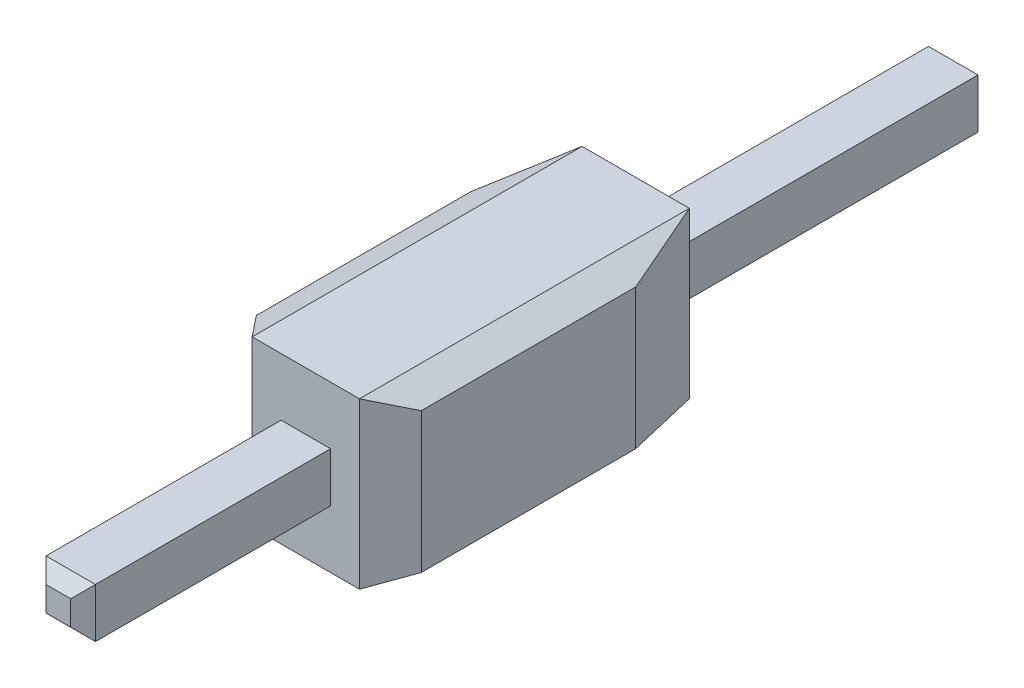
ISO-10303-21;
HEADER;
FILE_DESCRIPTION(('STEP AP214'),'2;1');
FILE_NAME('part.step','',(''),(''),'','','');
FILE_SCHEMA(('AUTOMOTIVE_DESIGN { 1 0 10303 214 1 1 1 1 }'));
ENDSEC;
DATA;
#1=APPLICATION_CONTEXT('core data for automotive mechanical design processes');
#2=APPLICATION_PROTOCOL_DEFINITION('international standard','automotive_design',2000,#1);
#3=PRODUCT_CONTEXT('',#1,'mechanical');
#4=PRODUCT('Part','Part','',(#3));
#5=PRODUCT_RELATED_PRODUCT_CATEGORY('part','',(#4));
#6=PRODUCT_DEFINITION_FORMATION('','',#4);
#7=PRODUCT_DEFINITION_CONTEXT('part definition',#1,'design');
#8=PRODUCT_DEFINITION('design','',#6,#7);
#9=PRODUCT_DEFINITION_SHAPE('','',#8);
#10=(LENGTH_UNIT() NAMED_UNIT(*) SI_UNIT(.MILLI.,.METRE.));
#11=(NAMED_UNIT(*) PLANE_ANGLE_UNIT() SI_UNIT($,.RADIAN.));
#12=(NAMED_UNIT(*) SI_UNIT($,.STERADIAN.) SOLID_ANGLE_UNIT());
#13=UNCERTAINTY_MEASURE_WITH_UNIT(LENGTH_MEASURE(1.E-05),#10,'distance_accuracy_value','');
#14=(GEOMETRIC_REPRESENTATION_CONTEXT(3) GLOBAL_UNCERTAINTY_ASSIGNED_CONTEXT((#13)) GLOBAL_UNIT_ASSIGNED_CONTEXT((#10,
#11,#12)) REPRESENTATION_CONTEXT('',''));
#15=CARTESIAN_POINT('',(0.,0.,0.));
#16=DIRECTION('',(0.,0.,1.));
#17=DIRECTION('',(1.,0.,0.));
#18=AXIS2_PLACEMENT_3D('',#15,#16,#17);
#19=CARTESIAN_POINT('',(-1.27,1.079,1.27));
#20=DIRECTION('',(-1.,0.,0.));
#21=DIRECTION('',(0.,0.,1.));
#22=AXIS2_PLACEMENT_3D('',#19,#20,#21);
#23=PLANE('',#22);
#24=CARTESIAN_POINT('',(-1.27,1.079,1.27));
#25=DIRECTION('',(0.,-1.,0.));
#26=VECTOR('',#25,1.);
#27=LINE('',#24,#26);
#28=CARTESIAN_POINT('',(-1.27,1.079,1.27));
#29=VERTEX_POINT('',#28);
#30=CARTESIAN_POINT('',(-1.27,-1.079,1.27));
#31=VERTEX_POINT('',#30);
#32=EDGE_CURVE('P0_E11',#29,#31,#27,.T.);
#33=ORIENTED_EDGE('',*,*,#32,.T.);
#34=DIRECTION('',(0.,0.,1.));
#35=VECTOR('',#34,1.);
#36=CARTESIAN_POINT('',(-1.27,-1.079,1.27));
#37=LINE('',#36,#35);
#38=CARTESIAN_POINT('',(-1.27,-1.079,4.572));
#39=VERTEX_POINT('',#38);
#40=EDGE_CURVE('P0_E118',#31,#39,#37,.T.);
#41=ORIENTED_EDGE('',*,*,#40,.T.);
#42=DIRECTION('',(0.,1.,0.));
#43=VECTOR('',#42,1.);
#44=CARTESIAN_POINT('',(-1.27,-1.079,4.572));
#45=LINE('',#44,#43);
#46=CARTESIAN_POINT('',(-1.27,1.079,4.572));
#47=VERTEX_POINT('',#46);
#48=EDGE_CURVE('P0_E359',#39,#47,#45,.T.);
#49=ORIENTED_EDGE('',*,*,#48,.T.);
#50=CARTESIAN_POINT('',(-1.27,1.079,4.572));
#51=DIRECTION('',(0.,0.,-1.));
#52=VECTOR('',#51,1.);
#53=LINE('',#50,#52);
#54=EDGE_CURVE('P0_E137',#47,#29,#53,.T.);
#55=ORIENTED_EDGE('',*,*,#54,.T.);
#56=EDGE_LOOP('',(#33,#41,#49,#55));
#57=FACE_BOUND('',#56,.T.);
#58=ADVANCED_FACE('P0_F17',(#57),#23,.T.);
#59=CARTESIAN_POINT('',(-0.826,1.27,0.));
#60=DIRECTION('',(-0.94398300845877,0.,-0.329994060160375));
#61=DIRECTION('',(-0.329994060160375,0.,0.94398300845877));
#62=AXIS2_PLACEMENT_3D('',#59,#60,#61);
#63=PLANE('',#62);
#64=DIRECTION('',(0.,-1.,0.));
#65=VECTOR('',#64,1.);
#66=CARTESIAN_POINT('',(-0.826,1.27,0.));
#67=LINE('',#66,#65);
#68=CARTESIAN_POINT('',(-0.826,1.27,0.));
#69=VERTEX_POINT('',#68);
#70=CARTESIAN_POINT('',(-0.826,-1.27,0.));
#71=VERTEX_POINT('',#70);
#72=EDGE_CURVE('P0_E30',#69,#71,#67,.T.);
#73=ORIENTED_EDGE('',*,*,#72,.T.);
#74=CARTESIAN_POINT('',(-0.826,-1.27,0.));
#75=DIRECTION('',(-0.326746575551969,0.139947251159873,0.934693234306238));
#76=VECTOR('',#75,1.);
#77=LINE('',#74,#76);
#78=EDGE_CURVE('P0_E103',#71,#31,#77,.T.);
#79=ORIENTED_EDGE('',*,*,#78,.T.);
#80=ORIENTED_EDGE('',*,*,#32,.F.);
#81=CARTESIAN_POINT('',(-1.26996601722338,1.079,1.27001187957233));
#82=DIRECTION('',(0.326746575551969,0.139947251159874,-0.934693234306238));
#83=VECTOR('',#82,1.);
#84=LINE('',#81,#83);
#85=EDGE_CURVE('P0_E106',#29,#69,#84,.T.);
#86=ORIENTED_EDGE('',*,*,#85,.T.);
#87=EDGE_LOOP('',(#73,#79,#80,#86));
#88=FACE_BOUND('',#87,.T.);
#89=ADVANCED_FACE('P0_F101',(#88),#63,.T.);
#90=CARTESIAN_POINT('',(-0.826,1.27,0.));
#91=DIRECTION('',(0.,0.,-1.));
#92=DIRECTION('',(0.,-1.,0.));
#93=AXIS2_PLACEMENT_3D('',#90,#91,#92);
#94=PLANE('',#93);
#95=DIRECTION('',(1.,0.,0.));
#96=VECTOR('',#95,1.);
#97=CARTESIAN_POINT('',(-0.826,1.27,0.));
#98=LINE('',#97,#96);
#99=CARTESIAN_POINT('',(0.826,1.27,0.));
#100=VERTEX_POINT('',#99);
#101=EDGE_CURVE('P0_E440',#69,#100,#98,.T.);
#102=ORIENTED_EDGE('',*,*,#101,.T.);
#103=DIRECTION('',(0.,-1.,0.));
#104=VECTOR('',#103,1.);
#105=CARTESIAN_POINT('',(0.826,1.27,0.));
#106=LINE('',#105,#104);
#107=CARTESIAN_POINT('',(0.826,-1.27,0.));
#108=VERTEX_POINT('',#107);
#109=EDGE_CURVE('P0_E43',#100,#108,#106,.T.);
#110=ORIENTED_EDGE('',*,*,#109,.T.);
#111=DIRECTION('',(-1.,0.,0.));
#112=VECTOR('',#111,1.);
#113=CARTESIAN_POINT('',(0.826,-1.27,0.));
#114=LINE('',#113,#112);
#115=EDGE_CURVE('P0_E112',#108,#71,#114,.T.);
#116=ORIENTED_EDGE('',*,*,#115,.T.);
#117=ORIENTED_EDGE('',*,*,#72,.F.);
#118=EDGE_LOOP('',(#102,#110,#116,#117));
#119=FACE_BOUND('',#118,.T.);
#120=ADVANCED_FACE('P0_F114',(#119),#94,.T.);
#121=CARTESIAN_POINT('',(0.826,-1.27,0.));
#122=DIRECTION('',(0.94398300845877,0.,-0.329994060160375));
#123=DIRECTION('',(0.,-1.,0.));
#124=AXIS2_PLACEMENT_3D('',#121,#122,#123);
#125=PLANE('',#124);
#126=ORIENTED_EDGE('',*,*,#109,.F.);
#127=CARTESIAN_POINT('',(0.826,1.27,0.));
#128=DIRECTION('',(0.326746575551969,-0.139947251159873,0.934693234306238));
#129=VECTOR('',#128,1.);
#130=LINE('',#127,#129);
#131=CARTESIAN_POINT('',(1.27,1.079,1.27));
#132=VERTEX_POINT('',#131);
#133=EDGE_CURVE('P0_E419',#100,#132,#130,.T.);
#134=ORIENTED_EDGE('',*,*,#133,.T.);
#135=CARTESIAN_POINT('',(1.26996601722338,1.079,1.27001187957233));
#136=DIRECTION('',(0.,-1.,0.));
#137=VECTOR('',#136,1.);
#138=LINE('',#135,#137);
#139=CARTESIAN_POINT('',(1.27,-1.079,1.27));
#140=VERTEX_POINT('',#139);
#141=EDGE_CURVE('P0_E365',#132,#140,#138,.T.);
#142=ORIENTED_EDGE('',*,*,#141,.T.);
#143=CARTESIAN_POINT('',(1.26996601722338,-1.079,1.27001187957233));
#144=DIRECTION('',(-0.326746575551969,-0.139947251159874,-0.934693234306238));
#145=VECTOR('',#144,1.);
#146=LINE('',#143,#145);
#147=EDGE_CURVE('P0_E443',#140,#108,#146,.T.);
#148=ORIENTED_EDGE('',*,*,#147,.T.);
#149=EDGE_LOOP('',(#126,#134,#142,#148));
#150=FACE_BOUND('',#149,.T.);
#151=ADVANCED_FACE('P0_F225',(#150),#125,.T.);
#152=CARTESIAN_POINT('',(0.826,-1.27,0.));
#153=DIRECTION('',(0.39403999708966,-0.919093292704054,0.));
#154=DIRECTION('',(0.,0.,-1.));
#155=AXIS2_PLACEMENT_3D('',#152,#153,#154);
#156=PLANE('',#155);
#157=ORIENTED_EDGE('',*,*,#147,.F.);
#158=CARTESIAN_POINT('',(1.27023368943896,-1.07954507765076,1.27));
#159=DIRECTION('',(0.,0.,1.));
#160=VECTOR('',#159,1.);
#161=LINE('',#158,#160);
#162=CARTESIAN_POINT('',(1.27,-1.079,4.572));
#163=VERTEX_POINT('',#162);
#164=EDGE_CURVE('P0_E310',#140,#163,#161,.T.);
#165=ORIENTED_EDGE('',*,*,#164,.T.);
#166=CARTESIAN_POINT('',(1.27023368943896,-1.07954507765076,4.572));
#167=DIRECTION('',(-0.634031018406954,-0.27182613846827,0.723958022362672));
#168=VECTOR('',#167,1.);
#169=LINE('',#166,#168);
#170=CARTESIAN_POINT('',(0.826,-1.27,5.08));
#171=VERTEX_POINT('',#170);
#172=EDGE_CURVE('P0_E270',#163,#171,#169,.T.);
#173=ORIENTED_EDGE('',*,*,#172,.T.);
#174=DIRECTION('',(0.,0.,-1.));
#175=VECTOR('',#174,1.);
#176=CARTESIAN_POINT('',(0.826,-1.27,5.08));
#177=LINE('',#176,#175);
#178=EDGE_CURVE('P0_E117',#171,#108,#177,.T.);
#179=ORIENTED_EDGE('',*,*,#178,.T.);
#180=EDGE_LOOP('',(#157,#165,#173,#179));
#181=FACE_BOUND('',#180,.T.);
#182=ADVANCED_FACE('P0_F275',(#181),#156,.T.);
#183=CARTESIAN_POINT('',(-0.826,-1.27,0.));
#184=DIRECTION('',(0.,-1.,0.));
#185=DIRECTION('',(0.,0.,-1.));
#186=AXIS2_PLACEMENT_3D('',#183,#184,#185);
#187=PLANE('',#186);
#188=ORIENTED_EDGE('',*,*,#115,.F.);
#189=ORIENTED_EDGE('',*,*,#178,.F.);
#190=DIRECTION('',(-1.,0.,0.));
#191=VECTOR('',#190,1.);
#192=CARTESIAN_POINT('',(0.826,-1.27,5.08));
#193=LINE('',#192,#191);
#194=CARTESIAN_POINT('',(-0.826,-1.27,5.08));
#195=VERTEX_POINT('',#194);
#196=EDGE_CURVE('P0_E125',#171,#195,#193,.T.);
#197=ORIENTED_EDGE('',*,*,#196,.T.);
#198=CARTESIAN_POINT('',(-0.826,-1.27,5.08));
#199=DIRECTION('',(0.,0.,-1.));
#200=VECTOR('',#199,1.);
#201=LINE('',#198,#200);
#202=EDGE_CURVE('P0_E121',#195,#71,#201,.T.);
#203=ORIENTED_EDGE('',*,*,#202,.T.);
#204=EDGE_LOOP('',(#188,#189,#197,#203));
#205=FACE_BOUND('',#204,.T.);
#206=ADVANCED_FACE('P0_F123',(#205),#187,.T.);
#207=CARTESIAN_POINT('',(-1.27,-1.079,1.27));
#208=DIRECTION('',(-0.39403999708966,-0.919093292704054,0.));
#209=DIRECTION('',(-0.919093292704054,0.39403999708966,0.));
#210=AXIS2_PLACEMENT_3D('',#207,#208,#209);
#211=PLANE('',#210);
#212=ORIENTED_EDGE('',*,*,#78,.F.);
#213=ORIENTED_EDGE('',*,*,#202,.F.);
#214=CARTESIAN_POINT('',(-0.825766310561044,-1.26945492234924,5.08));
#215=DIRECTION('',(-0.634031018406954,0.27182613846827,-0.723958022362671));
#216=VECTOR('',#215,1.);
#217=LINE('',#214,#216);
#218=EDGE_CURVE('P0_E183',#195,#39,#217,.T.);
#219=ORIENTED_EDGE('',*,*,#218,.T.);
#220=ORIENTED_EDGE('',*,*,#40,.F.);
#221=EDGE_LOOP('',(#212,#213,#219,#220));
#222=FACE_BOUND('',#221,.T.);
#223=ADVANCED_FACE('P0_F135',(#222),#211,.T.);
#224=CARTESIAN_POINT('',(-0.826,1.27,0.));
#225=DIRECTION('',(-0.39403999708966,0.919093292704054,0.));
#226=DIRECTION('',(0.,0.,1.));
#227=AXIS2_PLACEMENT_3D('',#224,#225,#226);
#228=PLANE('',#227);
#229=ORIENTED_EDGE('',*,*,#85,.F.);
#230=ORIENTED_EDGE('',*,*,#54,.F.);
#231=CARTESIAN_POINT('',(-1.27023368943896,1.07954507765076,4.572));
#232=DIRECTION('',(0.634031018406954,0.27182613846827,0.723958022362672));
#233=VECTOR('',#232,1.);
#234=LINE('',#231,#233);
#235=CARTESIAN_POINT('',(-0.826,1.27,5.08));
#236=VERTEX_POINT('',#235);
#237=EDGE_CURVE('P0_E342',#47,#236,#234,.T.);
#238=ORIENTED_EDGE('',*,*,#237,.T.);
#239=DIRECTION('',(0.,0.,-1.));
#240=VECTOR('',#239,1.);
#241=CARTESIAN_POINT('',(-0.826,1.27,5.08));
#242=LINE('',#241,#240);
#243=EDGE_CURVE('P0_E484',#236,#69,#242,.T.);
#244=ORIENTED_EDGE('',*,*,#243,.T.);
#245=EDGE_LOOP('',(#229,#230,#238,#244));
#246=FACE_BOUND('',#245,.T.);
#247=ADVANCED_FACE('P0_F157',(#246),#228,.T.);
#248=CARTESIAN_POINT('',(0.826,1.27,0.));
#249=DIRECTION('',(0.,1.,0.));
#250=DIRECTION('',(1.,0.,0.));
#251=AXIS2_PLACEMENT_3D('',#248,#249,#250);
#252=PLANE('',#251);
#253=ORIENTED_EDGE('',*,*,#101,.F.);
#254=ORIENTED_EDGE('',*,*,#243,.F.);
#255=DIRECTION('',(1.,0.,0.));
#256=VECTOR('',#255,1.);
#257=CARTESIAN_POINT('',(-0.826,1.27,5.08));
#258=LINE('',#257,#256);
#259=CARTESIAN_POINT('',(0.826,1.27,5.08));
#260=VERTEX_POINT('',#259);
#261=EDGE_CURVE('P0_E372',#236,#260,#258,.T.);
#262=ORIENTED_EDGE('',*,*,#261,.T.);
#263=CARTESIAN_POINT('',(0.826,1.27,5.08));
#264=DIRECTION('',(0.,0.,-1.));
#265=VECTOR('',#264,1.);
#266=LINE('',#263,#265);
#267=EDGE_CURVE('P0_E391',#260,#100,#266,.T.);
#268=ORIENTED_EDGE('',*,*,#267,.T.);
#269=EDGE_LOOP('',(#253,#254,#262,#268));
#270=FACE_BOUND('',#269,.T.);
#271=ADVANCED_FACE('P0_F325',(#270),#252,.T.);
#272=CARTESIAN_POINT('',(1.27,1.079,1.27));
#273=DIRECTION('',(0.39403999708966,0.919093292704054,0.));
#274=DIRECTION('',(0.,0.,-1.));
#275=AXIS2_PLACEMENT_3D('',#272,#273,#274);
#276=PLANE('',#275);
#277=ORIENTED_EDGE('',*,*,#133,.F.);
#278=ORIENTED_EDGE('',*,*,#267,.F.);
#279=CARTESIAN_POINT('',(0.825766310561044,1.26945492234924,5.08));
#280=DIRECTION('',(0.634031018406954,-0.27182613846827,-0.723958022362671));
#281=VECTOR('',#280,1.);
#282=LINE('',#279,#281);
#283=CARTESIAN_POINT('',(1.27,1.079,4.572));
#284=VERTEX_POINT('',#283);
#285=EDGE_CURVE('P0_E449',#260,#284,#282,.T.);
#286=ORIENTED_EDGE('',*,*,#285,.T.);
#287=DIRECTION('',(0.,0.,-1.));
#288=VECTOR('',#287,1.);
#289=CARTESIAN_POINT('',(1.27,1.079,4.572));
#290=LINE('',#289,#288);
#291=EDGE_CURVE('P0_E406',#284,#132,#290,.T.);
#292=ORIENTED_EDGE('',*,*,#291,.T.);
#293=EDGE_LOOP('',(#277,#278,#286,#292));
#294=FACE_BOUND('',#293,.T.);
#295=ADVANCED_FACE('P0_F223',(#294),#276,.T.);
#296=CARTESIAN_POINT('',(1.27,-1.079,1.27));
#297=DIRECTION('',(1.,0.,0.));
#298=DIRECTION('',(0.,1.,0.));
#299=AXIS2_PLACEMENT_3D('',#296,#297,#298);
#300=PLANE('',#299);
#301=ORIENTED_EDGE('',*,*,#141,.F.);
#302=ORIENTED_EDGE('',*,*,#291,.F.);
#303=DIRECTION('',(0.,-1.,0.));
#304=VECTOR('',#303,1.);
#305=CARTESIAN_POINT('',(1.27,1.079,4.572));
#306=LINE('',#305,#304);
#307=EDGE_CURVE('P0_E315',#284,#163,#306,.T.);
#308=ORIENTED_EDGE('',*,*,#307,.T.);
#309=ORIENTED_EDGE('',*,*,#164,.F.);
#310=EDGE_LOOP('',(#301,#302,#308,#309));
#311=FACE_BOUND('',#310,.T.);
#312=ADVANCED_FACE('P0_F317',(#311),#300,.T.);
#313=CARTESIAN_POINT('',(-1.27,-1.079,4.572));
#314=DIRECTION('',(-0.752514784395664,0.,0.658575355799127));
#315=DIRECTION('',(0.,1.,0.));
#316=AXIS2_PLACEMENT_3D('',#313,#314,#315);
#317=PLANE('',#316);
#318=ORIENTED_EDGE('',*,*,#218,.F.);
#319=CARTESIAN_POINT('',(-0.825669106852161,-1.27,5.0797104135665));
#320=DIRECTION('',(0.,1.,0.));
#321=VECTOR('',#320,1.);
#322=LINE('',#319,#321);
#323=EDGE_CURVE('P0_E195',#195,#236,#322,.T.);
#324=ORIENTED_EDGE('',*,*,#323,.T.);
#325=ORIENTED_EDGE('',*,*,#237,.F.);
#326=ORIENTED_EDGE('',*,*,#48,.F.);
#327=EDGE_LOOP('',(#318,#324,#325,#326));
#328=FACE_BOUND('',#327,.T.);
#329=ADVANCED_FACE('P0_F160',(#328),#317,.T.);
#330=CARTESIAN_POINT('',(-0.826,-1.27,5.08));
#331=DIRECTION('',(0.,0.,1.));
#332=DIRECTION('',(1.,0.,0.));
#333=AXIS2_PLACEMENT_3D('',#330,#331,#332);
#334=PLANE('',#333);
#335=ORIENTED_EDGE('',*,*,#196,.F.);
#336=CARTESIAN_POINT('',(0.826,-1.27,5.08));
#337=DIRECTION('',(0.,1.,0.));
#338=VECTOR('',#337,1.);
#339=LINE('',#336,#338);
#340=EDGE_CURVE('P0_E245',#171,#260,#339,.T.);
#341=ORIENTED_EDGE('',*,*,#340,.T.);
#342=ORIENTED_EDGE('',*,*,#261,.F.);
#343=ORIENTED_EDGE('',*,*,#323,.F.);
#344=EDGE_LOOP('',(#335,#341,#342,#343));
#345=FACE_BOUND('',#344,.T.);
#346=ADVANCED_FACE('P0_F213',(#345),#334,.T.);
#347=CARTESIAN_POINT('',(1.27,-1.079,4.572));
#348=DIRECTION('',(0.752514784395664,0.,0.658575355799127));
#349=DIRECTION('',(0.,-1.,0.));
#350=AXIS2_PLACEMENT_3D('',#347,#348,#349);
#351=PLANE('',#350);
#352=ORIENTED_EDGE('',*,*,#307,.F.);
#353=ORIENTED_EDGE('',*,*,#285,.F.);
#354=ORIENTED_EDGE('',*,*,#340,.F.);
#355=ORIENTED_EDGE('',*,*,#172,.F.);
#356=EDGE_LOOP('',(#352,#353,#354,#355));
#357=FACE_BOUND('',#356,.T.);
#358=ADVANCED_FACE('P0_F222',(#357),#351,.T.);
#359=CLOSED_SHELL('',(#58,#89,#120,#151,#182,#206,#223,#247,#271,#295,#312,#329,#346,#358));
#360=MANIFOLD_SOLID_BREP('P0_B1',#359);
#361=CARTESIAN_POINT('',(-0.381,0.381,5.08));
#362=DIRECTION('',(0.,0.,-1.));
#363=DIRECTION('',(0.,-1.,0.));
#364=AXIS2_PLACEMENT_3D('',#361,#362,#363);
#365=PLANE('',#364);
#366=DIRECTION('',(1.,0.,0.));
#367=VECTOR('',#366,1.);
#368=CARTESIAN_POINT('',(-0.381,0.381,5.08));
#369=LINE('',#368,#367);
#370=CARTESIAN_POINT('',(-0.381,0.381,5.08));
#371=VERTEX_POINT('',#370);
#372=CARTESIAN_POINT('',(0.381,0.381,5.08));
#373=VERTEX_POINT('',#372);
#374=EDGE_CURVE('P1_E302',#371,#373,#369,.T.);
#375=ORIENTED_EDGE('',*,*,#374,.T.);
#376=DIRECTION('',(0.,-1.,0.));
#377=VECTOR('',#376,1.);
#378=CARTESIAN_POINT('',(0.381,0.381,5.08));
#379=LINE('',#378,#377);
#380=CARTESIAN_POINT('',(0.381,-0.381,5.08));
#381=VERTEX_POINT('',#380);
#382=EDGE_CURVE('P1_E291',#373,#381,#379,.T.);
#383=ORIENTED_EDGE('',*,*,#382,.T.);
#384=DIRECTION('',(-1.,0.,0.));
#385=VECTOR('',#384,1.);
#386=CARTESIAN_POINT('',(0.381,-0.381,5.08));
#387=LINE('',#386,#385);
#388=CARTESIAN_POINT('',(-0.381,-0.381,5.08));
#389=VERTEX_POINT('',#388);
#390=EDGE_CURVE('P1_E11',#381,#389,#387,.T.);
#391=ORIENTED_EDGE('',*,*,#390,.T.);
#392=DIRECTION('',(0.,1.,0.));
#393=VECTOR('',#392,1.);
#394=CARTESIAN_POINT('',(-0.381,-0.381,5.08));
#395=LINE('',#394,#393);
#396=EDGE_CURVE('P1_E46',#389,#371,#395,.T.);
#397=ORIENTED_EDGE('',*,*,#396,.T.);
#398=EDGE_LOOP('',(#375,#383,#391,#397));
#399=FACE_BOUND('',#398,.T.);
#400=ADVANCED_FACE('P1_F17',(#399),#365,.T.);
#401=CARTESIAN_POINT('',(-0.381,-0.381,5.08));
#402=DIRECTION('',(0.,-1.,0.));
#403=DIRECTION('',(0.,0.,-1.));
#404=AXIS2_PLACEMENT_3D('',#401,#402,#403);
#405=PLANE('',#404);
#406=ORIENTED_EDGE('',*,*,#390,.F.);
#407=DIRECTION('',(0.,0.,1.));
#408=VECTOR('',#407,1.);
#409=CARTESIAN_POINT('',(0.381,-0.381,5.08));
#410=LINE('',#409,#408);
#411=CARTESIAN_POINT('',(0.381,-0.381,8.7));
#412=VERTEX_POINT('',#411);
#413=EDGE_CURVE('P1_E290',#381,#412,#410,.T.);
#414=ORIENTED_EDGE('',*,*,#413,.T.);
#415=DIRECTION('',(-1.,0.,0.));
#416=VECTOR('',#415,1.);
#417=CARTESIAN_POINT('',(0.381,-0.381,8.7));
#418=LINE('',#417,#416);
#419=CARTESIAN_POINT('',(-0.381,-0.381,8.7));
#420=VERTEX_POINT('',#419);
#421=EDGE_CURVE('P1_E98',#412,#420,#418,.T.);
#422=ORIENTED_EDGE('',*,*,#421,.T.);
#423=DIRECTION('',(0.,0.,-1.));
#424=VECTOR('',#423,1.);
#425=CARTESIAN_POINT('',(-0.381,-0.381,8.7));
#426=LINE('',#425,#424);
#427=EDGE_CURVE('P1_E28',#420,#389,#426,.T.);
#428=ORIENTED_EDGE('',*,*,#427,.T.);
#429=EDGE_LOOP('',(#406,#414,#422,#428));
#430=FACE_BOUND('',#429,.T.);
#431=ADVANCED_FACE('P1_F326',(#430),#405,.T.);
#432=CARTESIAN_POINT('',(-0.381,0.381,5.08));
#433=DIRECTION('',(-1.,0.,0.));
#434=DIRECTION('',(0.,0.,1.));
#435=AXIS2_PLACEMENT_3D('',#432,#433,#434);
#436=PLANE('',#435);
#437=ORIENTED_EDGE('',*,*,#396,.F.);
#438=ORIENTED_EDGE('',*,*,#427,.F.);
#439=DIRECTION('',(0.,1.,0.));
#440=VECTOR('',#439,1.);
#441=CARTESIAN_POINT('',(-0.381,-0.381,8.7));
#442=LINE('',#441,#440);
#443=CARTESIAN_POINT('',(-0.381,0.381,8.7));
#444=VERTEX_POINT('',#443);
#445=EDGE_CURVE('P1_E305',#420,#444,#442,.T.);
#446=ORIENTED_EDGE('',*,*,#445,.T.);
#447=DIRECTION('',(0.,0.,-1.));
#448=VECTOR('',#447,1.);
#449=CARTESIAN_POINT('',(-0.381,0.381,8.7));
#450=LINE('',#449,#448);
#451=EDGE_CURVE('P1_E299',#444,#371,#450,.T.);
#452=ORIENTED_EDGE('',*,*,#451,.T.);
#453=EDGE_LOOP('',(#437,#438,#446,#452));
#454=FACE_BOUND('',#453,.T.);
#455=ADVANCED_FACE('P1_F145',(#454),#436,.T.);
#456=CARTESIAN_POINT('',(0.381,0.381,5.08));
#457=DIRECTION('',(0.,1.,0.));
#458=DIRECTION('',(1.,0.,0.));
#459=AXIS2_PLACEMENT_3D('',#456,#457,#458);
#460=PLANE('',#459);
#461=ORIENTED_EDGE('',*,*,#374,.F.);
#462=ORIENTED_EDGE('',*,*,#451,.F.);
#463=DIRECTION('',(1.,0.,0.));
#464=VECTOR('',#463,1.);
#465=CARTESIAN_POINT('',(-0.381,0.381,8.7));
#466=LINE('',#465,#464);
#467=CARTESIAN_POINT('',(0.381,0.381,8.7));
#468=VERTEX_POINT('',#467);
#469=EDGE_CURVE('P1_E103',#444,#468,#466,.T.);
#470=ORIENTED_EDGE('',*,*,#469,.T.);
#471=DIRECTION('',(0.,0.,-1.));
#472=VECTOR('',#471,1.);
#473=CARTESIAN_POINT('',(0.381,0.381,8.7));
#474=LINE('',#473,#472);
#475=EDGE_CURVE('P1_E286',#468,#373,#474,.T.);
#476=ORIENTED_EDGE('',*,*,#475,.T.);
#477=EDGE_LOOP('',(#461,#462,#470,#476));
#478=FACE_BOUND('',#477,.T.);
#479=ADVANCED_FACE('P1_F330',(#478),#460,.T.);
#480=CARTESIAN_POINT('',(0.381,-0.381,5.08));
#481=DIRECTION('',(1.,0.,0.));
#482=DIRECTION('',(0.,1.,0.));
#483=AXIS2_PLACEMENT_3D('',#480,#481,#482);
#484=PLANE('',#483);
#485=ORIENTED_EDGE('',*,*,#382,.F.);
#486=ORIENTED_EDGE('',*,*,#475,.F.);
#487=DIRECTION('',(0.,-1.,0.));
#488=VECTOR('',#487,1.);
#489=CARTESIAN_POINT('',(0.381,0.381,8.7));
#490=LINE('',#489,#488);
#491=EDGE_CURVE('P1_E274',#468,#412,#490,.T.);
#492=ORIENTED_EDGE('',*,*,#491,.T.);
#493=ORIENTED_EDGE('',*,*,#413,.F.);
#494=EDGE_LOOP('',(#485,#486,#492,#493));
#495=FACE_BOUND('',#494,.T.);
#496=ADVANCED_FACE('P1_F141',(#495),#484,.T.);
#497=CARTESIAN_POINT('',(-0.381,-0.381,8.7));
#498=DIRECTION('',(0.,-0.707106781186548,0.707106781186548));
#499=DIRECTION('',(-1.,0.,0.));
#500=AXIS2_PLACEMENT_3D('',#497,#498,#499);
#501=PLANE('',#500);
#502=ORIENTED_EDGE('',*,*,#421,.F.);
#503=DIRECTION('',(-0.577350269189626,0.577350269189626,0.577350269189626));
#504=VECTOR('',#503,1.);
#505=CARTESIAN_POINT('',(0.381,-0.381,8.7));
#506=LINE('',#505,#504);
#507=CARTESIAN_POINT('',(0.19,-0.19,8.89));
#508=VERTEX_POINT('',#507);
#509=EDGE_CURVE('P1_E90',#412,#508,#506,.T.);
#510=ORIENTED_EDGE('',*,*,#509,.T.);
#511=CARTESIAN_POINT('',(0.19,-0.190499999999999,8.8905));
#512=DIRECTION('',(-1.,0.,0.));
#513=VECTOR('',#512,1.);
#514=LINE('',#511,#513);
#515=CARTESIAN_POINT('',(-0.19,-0.19,8.89));
#516=VERTEX_POINT('',#515);
#517=EDGE_CURVE('P1_E95',#508,#516,#514,.T.);
#518=ORIENTED_EDGE('',*,*,#517,.T.);
#519=CARTESIAN_POINT('',(-0.19,-0.1905,8.8905));
#520=DIRECTION('',(-0.577350269189626,-0.577350269189626,-0.577350269189626));
#521=VECTOR('',#520,1.);
#522=LINE('',#519,#521);
#523=EDGE_CURVE('P1_E162',#516,#420,#522,.T.);
#524=ORIENTED_EDGE('',*,*,#523,.T.);
#525=EDGE_LOOP('',(#502,#510,#518,#524));
#526=FACE_BOUND('',#525,.T.);
#527=ADVANCED_FACE('P1_F92',(#526),#501,.T.);
#528=CARTESIAN_POINT('',(-0.381,0.381,8.7));
#529=DIRECTION('',(-0.707106781186548,0.,0.707106781186548));
#530=DIRECTION('',(0.,1.,0.));
#531=AXIS2_PLACEMENT_3D('',#528,#529,#530);
#532=PLANE('',#531);
#533=ORIENTED_EDGE('',*,*,#445,.F.);
#534=ORIENTED_EDGE('',*,*,#523,.F.);
#535=CARTESIAN_POINT('',(-0.190499999999999,-0.19,8.8905));
#536=DIRECTION('',(0.,1.,0.));
#537=VECTOR('',#536,1.);
#538=LINE('',#535,#537);
#539=CARTESIAN_POINT('',(-0.19,0.19,8.89));
#540=VERTEX_POINT('',#539);
#541=EDGE_CURVE('P1_E123',#516,#540,#538,.T.);
#542=ORIENTED_EDGE('',*,*,#541,.T.);
#543=CARTESIAN_POINT('',(-0.1905,0.19,8.8905));
#544=DIRECTION('',(-0.577350269189626,0.577350269189626,-0.577350269189626));
#545=VECTOR('',#544,1.);
#546=LINE('',#543,#545);
#547=EDGE_CURVE('P1_E191',#540,#444,#546,.T.);
#548=ORIENTED_EDGE('',*,*,#547,.T.);
#549=EDGE_LOOP('',(#533,#534,#542,#548));
#550=FACE_BOUND('',#549,.T.);
#551=ADVANCED_FACE('P1_F140',(#550),#532,.T.);
#552=CARTESIAN_POINT('',(0.381,0.381,8.7));
#553=DIRECTION('',(0.,0.707106781186548,0.707106781186548));
#554=DIRECTION('',(1.,0.,0.));
#555=AXIS2_PLACEMENT_3D('',#552,#553,#554);
#556=PLANE('',#555);
#557=ORIENTED_EDGE('',*,*,#469,.F.);
#558=ORIENTED_EDGE('',*,*,#547,.F.);
#559=CARTESIAN_POINT('',(-0.19,0.190499999999999,8.8905));
#560=DIRECTION('',(1.,0.,0.));
#561=VECTOR('',#560,1.);
#562=LINE('',#559,#561);
#563=CARTESIAN_POINT('',(0.19,0.19,8.89));
#564=VERTEX_POINT('',#563);
#565=EDGE_CURVE('P1_E117',#540,#564,#562,.T.);
#566=ORIENTED_EDGE('',*,*,#565,.T.);
#567=CARTESIAN_POINT('',(0.19,0.1905,8.8905));
#568=DIRECTION('',(0.577350269189626,0.577350269189626,-0.577350269189626));
#569=VECTOR('',#568,1.);
#570=LINE('',#567,#569);
#571=EDGE_CURVE('P1_E104',#564,#468,#570,.T.);
#572=ORIENTED_EDGE('',*,*,#571,.T.);
#573=EDGE_LOOP('',(#557,#558,#566,#572));
#574=FACE_BOUND('',#573,.T.);
#575=ADVANCED_FACE('P1_F142',(#574),#556,.T.);
#576=CARTESIAN_POINT('',(0.381,-0.381,8.7));
#577=DIRECTION('',(0.707106781186548,0.,0.707106781186548));
#578=DIRECTION('',(0.,-1.,0.));
#579=AXIS2_PLACEMENT_3D('',#576,#577,#578);
#580=PLANE('',#579);
#581=ORIENTED_EDGE('',*,*,#491,.F.);
#582=ORIENTED_EDGE('',*,*,#571,.F.);
#583=CARTESIAN_POINT('',(0.190499999999999,0.19,8.8905));
#584=DIRECTION('',(0.,-1.,0.));
#585=VECTOR('',#584,1.);
#586=LINE('',#583,#585);
#587=EDGE_CURVE('P1_E107',#564,#508,#586,.T.);
#588=ORIENTED_EDGE('',*,*,#587,.T.);
#589=ORIENTED_EDGE('',*,*,#509,.F.);
#590=EDGE_LOOP('',(#581,#582,#588,#589));
#591=FACE_BOUND('',#590,.T.);
#592=ADVANCED_FACE('P1_F109',(#591),#580,.T.);
#593=CARTESIAN_POINT('',(-0.19,-0.19,8.89));
#594=DIRECTION('',(0.,0.,1.));
#595=DIRECTION('',(1.,0.,0.));
#596=AXIS2_PLACEMENT_3D('',#593,#594,#595);
#597=PLANE('',#596);
#598=ORIENTED_EDGE('',*,*,#517,.F.);
#599=ORIENTED_EDGE('',*,*,#587,.F.);
#600=ORIENTED_EDGE('',*,*,#565,.F.);
#601=ORIENTED_EDGE('',*,*,#541,.F.);
#602=EDGE_LOOP('',(#598,#599,#600,#601));
#603=FACE_BOUND('',#602,.T.);
#604=ADVANCED_FACE('P1_F121',(#603),#597,.T.);
#605=CLOSED_SHELL('',(#400,#431,#455,#479,#496,#527,#551,#575,#592,#604));
#606=MANIFOLD_SOLID_BREP('P1_B1',#605);
#607=CARTESIAN_POINT('',(-0.19,0.19,-5.08));
#608=DIRECTION('',(0.,0.,-1.));
#609=DIRECTION('',(0.,-1.,0.));
#610=AXIS2_PLACEMENT_3D('',#607,#608,#609);
#611=PLANE('',#610);
#612=DIRECTION('',(1.,0.,0.));
#613=VECTOR('',#612,1.);
#614=CARTESIAN_POINT('',(-0.19,0.19,-5.08));
#615=LINE('',#614,#613);
#616=CARTESIAN_POINT('',(-0.19,0.19,-5.08));
#617=VERTEX_POINT('',#616);
#618=CARTESIAN_POINT('',(0.19,0.19,-5.08));
#619=VERTEX_POINT('',#618);
#620=EDGE_CURVE('P2_E85',#617,#619,#615,.T.);
#621=ORIENTED_EDGE('',*,*,#620,.T.);
#622=DIRECTION('',(0.,-1.,0.));
#623=VECTOR('',#622,1.);
#624=CARTESIAN_POINT('',(0.19,0.19,-5.08));
#625=LINE('',#624,#623);
#626=CARTESIAN_POINT('',(0.19,-0.19,-5.08));
#627=VERTEX_POINT('',#626);
#628=EDGE_CURVE('P2_E88',#619,#627,#625,.T.);
#629=ORIENTED_EDGE('',*,*,#628,.T.);
#630=DIRECTION('',(-1.,0.,0.));
#631=VECTOR('',#630,1.);
#632=CARTESIAN_POINT('',(0.19,-0.19,-5.08));
#633=LINE('',#632,#631);
#634=CARTESIAN_POINT('',(-0.19,-0.19,-5.08));
#635=VERTEX_POINT('',#634);
#636=EDGE_CURVE('P2_E11',#627,#635,#633,.T.);
#637=ORIENTED_EDGE('',*,*,#636,.T.);
#638=DIRECTION('',(0.,1.,0.));
#639=VECTOR('',#638,1.);
#640=CARTESIAN_POINT('',(-0.19,-0.19,-5.08));
#641=LINE('',#640,#639);
#642=EDGE_CURVE('P2_E49',#635,#617,#641,.T.);
#643=ORIENTED_EDGE('',*,*,#642,.T.);
#644=EDGE_LOOP('',(#621,#629,#637,#643));
#645=FACE_BOUND('',#644,.T.);
#646=ADVANCED_FACE('P2_F17',(#645),#611,.T.);
#647=CARTESIAN_POINT('',(-0.19,-0.19,-5.08));
#648=DIRECTION('',(0.,-0.707106781186548,-0.707106781186548));
#649=DIRECTION('',(0.,-0.707106781186548,0.707106781186548));
#650=AXIS2_PLACEMENT_3D('',#647,#648,#649);
#651=PLANE('',#650);
#652=ORIENTED_EDGE('',*,*,#636,.F.);
#653=DIRECTION('',(0.577350269189626,-0.577350269189626,0.577350269189626));
#654=VECTOR('',#653,1.);
#655=CARTESIAN_POINT('',(0.19,-0.19,-5.08));
#656=LINE('',#655,#654);
#657=CARTESIAN_POINT('',(0.381,-0.381,-4.89));
#658=VERTEX_POINT('',#657);
#659=EDGE_CURVE('P2_E92',#627,#658,#656,.T.);
#660=ORIENTED_EDGE('',*,*,#659,.T.);
#661=CARTESIAN_POINT('',(0.381000000000001,-0.380500000000001,-4.8895));
#662=DIRECTION('',(-1.,0.,0.));
#663=VECTOR('',#662,1.);
#664=LINE('',#661,#663);
#665=CARTESIAN_POINT('',(-0.381,-0.381,-4.89));
#666=VERTEX_POINT('',#665);
#667=EDGE_CURVE('P2_E111',#658,#666,#664,.T.);
#668=ORIENTED_EDGE('',*,*,#667,.T.);
#669=CARTESIAN_POINT('',(-0.381,-0.380500000000001,-4.8895));
#670=DIRECTION('',(0.577350269189626,0.577350269189626,-0.577350269189625));
#671=VECTOR('',#670,1.);
#672=LINE('',#669,#671);
#673=EDGE_CURVE('P2_E28',#666,#635,#672,.T.);
#674=ORIENTED_EDGE('',*,*,#673,.T.);
#675=EDGE_LOOP('',(#652,#660,#668,#674));
#676=FACE_BOUND('',#675,.T.);
#677=ADVANCED_FACE('P2_F166',(#676),#651,.T.);
#678=CARTESIAN_POINT('',(-0.19,0.19,-5.08));
#679=DIRECTION('',(-0.707106781186548,0.,-0.707106781186548));
#680=DIRECTION('',(-0.707106781186548,0.,0.707106781186548));
#681=AXIS2_PLACEMENT_3D('',#678,#679,#680);
#682=PLANE('',#681);
#683=ORIENTED_EDGE('',*,*,#642,.F.);
#684=ORIENTED_EDGE('',*,*,#673,.F.);
#685=CARTESIAN_POINT('',(-0.380500000000001,-0.381000000000001,-4.8895));
#686=DIRECTION('',(0.,1.,0.));
#687=VECTOR('',#686,1.);
#688=LINE('',#685,#687);
#689=CARTESIAN_POINT('',(-0.381,0.381,-4.89));
#690=VERTEX_POINT('',#689);
#691=EDGE_CURVE('P2_E302',#666,#690,#688,.T.);
#692=ORIENTED_EDGE('',*,*,#691,.T.);
#693=CARTESIAN_POINT('',(-0.380500000000001,0.381,-4.8895));
#694=DIRECTION('',(0.577350269189626,-0.577350269189626,-0.577350269189625));
#695=VECTOR('',#694,1.);
#696=LINE('',#693,#695);
#697=EDGE_CURVE('P2_E91',#690,#617,#696,.T.);
#698=ORIENTED_EDGE('',*,*,#697,.T.);
#699=EDGE_LOOP('',(#683,#684,#692,#698));
#700=FACE_BOUND('',#699,.T.);
#701=ADVANCED_FACE('P2_F175',(#700),#682,.T.);
#702=CARTESIAN_POINT('',(0.19,0.19,-5.08));
#703=DIRECTION('',(0.,0.707106781186548,-0.707106781186548));
#704=DIRECTION('',(-1.,0.,0.));
#705=AXIS2_PLACEMENT_3D('',#702,#703,#704);
#706=PLANE('',#705);
#707=ORIENTED_EDGE('',*,*,#620,.F.);
#708=ORIENTED_EDGE('',*,*,#697,.F.);
#709=CARTESIAN_POINT('',(-0.381,0.380500000000001,-4.8895));
#710=DIRECTION('',(1.,0.,0.));
#711=VECTOR('',#710,1.);
#712=LINE('',#709,#711);
#713=CARTESIAN_POINT('',(0.381,0.381,-4.89));
#714=VERTEX_POINT('',#713);
#715=EDGE_CURVE('P2_E99',#690,#714,#712,.T.);
#716=ORIENTED_EDGE('',*,*,#715,.T.);
#717=CARTESIAN_POINT('',(0.381,0.380500000000001,-4.8895));
#718=DIRECTION('',(-0.577350269189626,-0.577350269189626,-0.577350269189625));
#719=VECTOR('',#718,1.);
#720=LINE('',#717,#719);
#721=EDGE_CURVE('P2_E95',#714,#619,#720,.T.);
#722=ORIENTED_EDGE('',*,*,#721,.T.);
#723=EDGE_LOOP('',(#707,#708,#716,#722));
#724=FACE_BOUND('',#723,.T.);
#725=ADVANCED_FACE('P2_F97',(#724),#706,.T.);
#726=CARTESIAN_POINT('',(0.19,-0.19,-5.08));
#727=DIRECTION('',(0.707106781186548,0.,-0.707106781186548));
#728=DIRECTION('',(0.,-1.,0.));
#729=AXIS2_PLACEMENT_3D('',#726,#727,#728);
#730=PLANE('',#729);
#731=ORIENTED_EDGE('',*,*,#628,.F.);
#732=ORIENTED_EDGE('',*,*,#721,.F.);
#733=CARTESIAN_POINT('',(0.380500000000001,0.381,-4.8895));
#734=DIRECTION('',(0.,-1.,0.));
#735=VECTOR('',#734,1.);
#736=LINE('',#733,#735);
#737=EDGE_CURVE('P2_E144',#714,#658,#736,.T.);
#738=ORIENTED_EDGE('',*,*,#737,.T.);
#739=ORIENTED_EDGE('',*,*,#659,.F.);
#740=EDGE_LOOP('',(#731,#732,#738,#739));
#741=FACE_BOUND('',#740,.T.);
#742=ADVANCED_FACE('P2_F109',(#741),#730,.T.);
#743=CARTESIAN_POINT('',(-0.381,-0.381,-4.89));
#744=DIRECTION('',(0.,-1.,0.));
#745=DIRECTION('',(0.,0.,-1.));
#746=AXIS2_PLACEMENT_3D('',#743,#744,#745);
#747=PLANE('',#746);
#748=ORIENTED_EDGE('',*,*,#667,.F.);
#749=DIRECTION('',(0.,0.,1.));
#750=VECTOR('',#749,1.);
#751=CARTESIAN_POINT('',(0.381,-0.381,-4.89));
#752=LINE('',#751,#750);
#753=CARTESIAN_POINT('',(0.381,-0.381,0.));
#754=VERTEX_POINT('',#753);
#755=EDGE_CURVE('P2_E128',#658,#754,#752,.T.);
#756=ORIENTED_EDGE('',*,*,#755,.T.);
#757=DIRECTION('',(-1.,0.,0.));
#758=VECTOR('',#757,1.);
#759=CARTESIAN_POINT('',(0.381,-0.381,0.));
#760=LINE('',#759,#758);
#761=CARTESIAN_POINT('',(-0.381,-0.381,0.));
#762=VERTEX_POINT('',#761);
#763=EDGE_CURVE('P2_E283',#754,#762,#760,.T.);
#764=ORIENTED_EDGE('',*,*,#763,.T.);
#765=DIRECTION('',(0.,0.,-1.));
#766=VECTOR('',#765,1.);
#767=CARTESIAN_POINT('',(-0.381,-0.381,0.));
#768=LINE('',#767,#766);
#769=EDGE_CURVE('P2_E117',#762,#666,#768,.T.);
#770=ORIENTED_EDGE('',*,*,#769,.T.);
#771=EDGE_LOOP('',(#748,#756,#764,#770));
#772=FACE_BOUND('',#771,.T.);
#773=ADVANCED_FACE('P2_F210',(#772),#747,.T.);
#774=CARTESIAN_POINT('',(-0.381,0.381,-4.89));
#775=DIRECTION('',(-1.,0.,0.));
#776=DIRECTION('',(0.,0.,1.));
#777=AXIS2_PLACEMENT_3D('',#774,#775,#776);
#778=PLANE('',#777);
#779=ORIENTED_EDGE('',*,*,#691,.F.);
#780=ORIENTED_EDGE('',*,*,#769,.F.);
#781=DIRECTION('',(0.,1.,0.));
#782=VECTOR('',#781,1.);
#783=CARTESIAN_POINT('',(-0.381,-0.381,0.));
#784=LINE('',#783,#782);
#785=CARTESIAN_POINT('',(-0.381,0.381,0.));
#786=VERTEX_POINT('',#785);
#787=EDGE_CURVE('P2_E151',#762,#786,#784,.T.);
#788=ORIENTED_EDGE('',*,*,#787,.T.);
#789=DIRECTION('',(0.,0.,-1.));
#790=VECTOR('',#789,1.);
#791=CARTESIAN_POINT('',(-0.381,0.381,0.));
#792=LINE('',#791,#790);
#793=EDGE_CURVE('P2_E142',#786,#690,#792,.T.);
#794=ORIENTED_EDGE('',*,*,#793,.T.);
#795=EDGE_LOOP('',(#779,#780,#788,#794));
#796=FACE_BOUND('',#795,.T.);
#797=ADVANCED_FACE('P2_F307',(#796),#778,.T.);
#798=CARTESIAN_POINT('',(0.381,0.381,-4.89));
#799=DIRECTION('',(0.,1.,0.));
#800=DIRECTION('',(1.,0.,0.));
#801=AXIS2_PLACEMENT_3D('',#798,#799,#800);
#802=PLANE('',#801);
#803=ORIENTED_EDGE('',*,*,#715,.F.);
#804=ORIENTED_EDGE('',*,*,#793,.F.);
#805=DIRECTION('',(1.,0.,0.));
#806=VECTOR('',#805,1.);
#807=CARTESIAN_POINT('',(-0.381,0.381,0.));
#808=LINE('',#807,#806);
#809=CARTESIAN_POINT('',(0.381,0.381,0.));
#810=VERTEX_POINT('',#809);
#811=EDGE_CURVE('P2_E282',#786,#810,#808,.T.);
#812=ORIENTED_EDGE('',*,*,#811,.T.);
#813=DIRECTION('',(0.,0.,-1.));
#814=VECTOR('',#813,1.);
#815=CARTESIAN_POINT('',(0.381,0.381,0.));
#816=LINE('',#815,#814);
#817=EDGE_CURVE('P2_E131',#810,#714,#816,.T.);
#818=ORIENTED_EDGE('',*,*,#817,.T.);
#819=EDGE_LOOP('',(#803,#804,#812,#818));
#820=FACE_BOUND('',#819,.T.);
#821=ADVANCED_FACE('P2_F179',(#820),#802,.T.);
#822=CARTESIAN_POINT('',(0.381,-0.381,-4.89));
#823=DIRECTION('',(1.,0.,0.));
#824=DIRECTION('',(0.,1.,0.));
#825=AXIS2_PLACEMENT_3D('',#822,#823,#824);
#826=PLANE('',#825);
#827=ORIENTED_EDGE('',*,*,#737,.F.);
#828=ORIENTED_EDGE('',*,*,#817,.F.);
#829=DIRECTION('',(0.,-1.,0.));
#830=VECTOR('',#829,1.);
#831=CARTESIAN_POINT('',(0.381,0.381,0.));
#832=LINE('',#831,#830);
#833=EDGE_CURVE('P2_E277',#810,#754,#832,.T.);
#834=ORIENTED_EDGE('',*,*,#833,.T.);
#835=ORIENTED_EDGE('',*,*,#755,.F.);
#836=EDGE_LOOP('',(#827,#828,#834,#835));
#837=FACE_BOUND('',#836,.T.);
#838=ADVANCED_FACE('P2_F176',(#837),#826,.T.);
#839=CARTESIAN_POINT('',(-0.381,-0.381,0.));
#840=DIRECTION('',(0.,0.,1.));
#841=DIRECTION('',(1.,0.,0.));
#842=AXIS2_PLACEMENT_3D('',#839,#840,#841);
#843=PLANE('',#842);
#844=ORIENTED_EDGE('',*,*,#763,.F.);
#845=ORIENTED_EDGE('',*,*,#833,.F.);
#846=ORIENTED_EDGE('',*,*,#811,.F.);
#847=ORIENTED_EDGE('',*,*,#787,.F.);
#848=EDGE_LOOP('',(#844,#845,#846,#847));
#849=FACE_BOUND('',#848,.T.);
#850=ADVANCED_FACE('P2_F238',(#849),#843,.T.);
#851=CLOSED_SHELL('',(#646,#677,#701,#725,#742,#773,#797,#821,#838,#850));
#852=MANIFOLD_SOLID_BREP('P2_B1',#851);
#853=ADVANCED_BREP_SHAPE_REPRESENTATION('',(#18,#360,#606,#852),#14);
#854=SHAPE_DEFINITION_REPRESENTATION(#9,#853);
ENDSEC;
END-ISO-10303-21;
